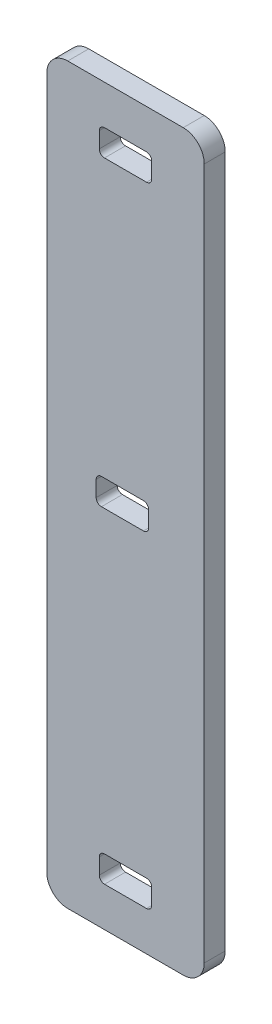
ISO-10303-21;
HEADER;
FILE_DESCRIPTION(('STEP AP214'),'2;1');
FILE_NAME('part.step','',(''),(''),'','','');
FILE_SCHEMA(('AUTOMOTIVE_DESIGN { 1 0 10303 214 1 1 1 1 }'));
ENDSEC;
DATA;
#1=APPLICATION_CONTEXT('core data for automotive mechanical design processes');
#2=APPLICATION_PROTOCOL_DEFINITION('international standard','automotive_design',2000,#1);
#3=PRODUCT_CONTEXT('',#1,'mechanical');
#4=PRODUCT('Part','Part','',(#3));
#5=PRODUCT_RELATED_PRODUCT_CATEGORY('part','',(#4));
#6=PRODUCT_DEFINITION_FORMATION('','',#4);
#7=PRODUCT_DEFINITION_CONTEXT('part definition',#1,'design');
#8=PRODUCT_DEFINITION('design','',#6,#7);
#9=PRODUCT_DEFINITION_SHAPE('','',#8);
#10=(LENGTH_UNIT() NAMED_UNIT(*) SI_UNIT(.MILLI.,.METRE.));
#11=(NAMED_UNIT(*) PLANE_ANGLE_UNIT() SI_UNIT($,.RADIAN.));
#12=(NAMED_UNIT(*) SI_UNIT($,.STERADIAN.) SOLID_ANGLE_UNIT());
#13=UNCERTAINTY_MEASURE_WITH_UNIT(LENGTH_MEASURE(1.E-05),#10,'distance_accuracy_value','');
#14=(GEOMETRIC_REPRESENTATION_CONTEXT(3) GLOBAL_UNCERTAINTY_ASSIGNED_CONTEXT((#13)) GLOBAL_UNIT_ASSIGNED_CONTEXT((#10,
#11,#12)) REPRESENTATION_CONTEXT('',''));
#15=CARTESIAN_POINT('',(0.,0.,0.));
#16=DIRECTION('',(0.,0.,1.));
#17=DIRECTION('',(1.,0.,0.));
#18=AXIS2_PLACEMENT_3D('',#15,#16,#17);
#19=CARTESIAN_POINT('',(-11.,-65.915,4.));
#20=DIRECTION('',(0.,0.,-1.));
#21=DIRECTION('',(-1.,0.,0.));
#22=AXIS2_PLACEMENT_3D('',#19,#20,#21);
#23=CYLINDRICAL_SURFACE('',#22,4.);
#24=CARTESIAN_POINT('',(-11.,-65.915,0.));
#25=DIRECTION('',(0.,0.,1.));
#26=DIRECTION('',(-1.,0.,0.));
#27=AXIS2_PLACEMENT_3D('',#24,#25,#26);
#28=CIRCLE('',#27,4.);
#29=CARTESIAN_POINT('',(-15.,-65.915,0.));
#30=VERTEX_POINT('',#29);
#31=CARTESIAN_POINT('',(-11.,-69.915,0.));
#32=VERTEX_POINT('',#31);
#33=EDGE_CURVE('E304',#30,#32,#28,.T.);
#34=ORIENTED_EDGE('',*,*,#33,.T.);
#35=DIRECTION('',(0.,0.,-1.));
#36=VECTOR('',#35,1.);
#37=CARTESIAN_POINT('',(-11.,-69.915,4.));
#38=LINE('',#37,#36);
#39=CARTESIAN_POINT('',(-11.,-69.915,4.));
#40=VERTEX_POINT('',#39);
#41=EDGE_CURVE('E11',#40,#32,#38,.T.);
#42=ORIENTED_EDGE('',*,*,#41,.F.);
#43=CARTESIAN_POINT('',(-11.,-65.915,4.));
#44=DIRECTION('',(0.,0.,1.));
#45=DIRECTION('',(-1.,0.,0.));
#46=AXIS2_PLACEMENT_3D('',#43,#44,#45);
#47=CIRCLE('',#46,4.);
#48=CARTESIAN_POINT('',(-15.,-65.915,4.));
#49=VERTEX_POINT('',#48);
#50=EDGE_CURVE('E441',#49,#40,#47,.T.);
#51=ORIENTED_EDGE('',*,*,#50,.F.);
#52=DIRECTION('',(0.,0.,-1.));
#53=VECTOR('',#52,1.);
#54=CARTESIAN_POINT('',(-15.,-65.915,4.));
#55=LINE('',#54,#53);
#56=EDGE_CURVE('E459',#49,#30,#55,.T.);
#57=ORIENTED_EDGE('',*,*,#56,.T.);
#58=EDGE_LOOP('',(#34,#42,#51,#57));
#59=FACE_BOUND('',#58,.T.);
#60=ADVANCED_FACE('F35',(#59),#23,.T.);
#61=CARTESIAN_POINT('',(-11.,-69.915,4.));
#62=DIRECTION('',(0.,1.,0.));
#63=DIRECTION('',(0.,0.,1.));
#64=AXIS2_PLACEMENT_3D('',#61,#62,#63);
#65=PLANE('',#64);
#66=DIRECTION('',(1.,0.,0.));
#67=VECTOR('',#66,1.);
#68=CARTESIAN_POINT('',(-11.,-69.915,0.));
#69=LINE('',#68,#67);
#70=CARTESIAN_POINT('',(11.,-69.915,0.));
#71=VERTEX_POINT('',#70);
#72=EDGE_CURVE('E462',#32,#71,#69,.T.);
#73=ORIENTED_EDGE('',*,*,#72,.T.);
#74=DIRECTION('',(0.,0.,-1.));
#75=VECTOR('',#74,1.);
#76=CARTESIAN_POINT('',(11.,-69.915,4.));
#77=LINE('',#76,#75);
#78=CARTESIAN_POINT('',(11.,-69.915,4.));
#79=VERTEX_POINT('',#78);
#80=EDGE_CURVE('E42',#79,#71,#77,.T.);
#81=ORIENTED_EDGE('',*,*,#80,.F.);
#82=DIRECTION('',(1.,0.,0.));
#83=VECTOR('',#82,1.);
#84=CARTESIAN_POINT('',(-11.,-69.915,4.));
#85=LINE('',#84,#83);
#86=EDGE_CURVE('E444',#40,#79,#85,.T.);
#87=ORIENTED_EDGE('',*,*,#86,.F.);
#88=ORIENTED_EDGE('',*,*,#41,.T.);
#89=EDGE_LOOP('',(#73,#81,#87,#88));
#90=FACE_BOUND('',#89,.T.);
#91=ADVANCED_FACE('F518',(#90),#65,.F.);
#92=CARTESIAN_POINT('',(11.,-65.915,4.));
#93=DIRECTION('',(0.,0.,-1.));
#94=DIRECTION('',(-1.,0.,0.));
#95=AXIS2_PLACEMENT_3D('',#92,#93,#94);
#96=CYLINDRICAL_SURFACE('',#95,4.);
#97=CARTESIAN_POINT('',(11.,-65.915,0.));
#98=DIRECTION('',(0.,0.,1.));
#99=DIRECTION('',(1.,0.,0.));
#100=AXIS2_PLACEMENT_3D('',#97,#98,#99);
#101=CIRCLE('',#100,4.);
#102=CARTESIAN_POINT('',(15.,-65.915,0.));
#103=VERTEX_POINT('',#102);
#104=EDGE_CURVE('E464',#71,#103,#101,.T.);
#105=ORIENTED_EDGE('',*,*,#104,.T.);
#106=DIRECTION('',(0.,0.,-1.));
#107=VECTOR('',#106,1.);
#108=CARTESIAN_POINT('',(15.,-65.915,4.));
#109=LINE('',#108,#107);
#110=CARTESIAN_POINT('',(15.,-65.915,4.));
#111=VERTEX_POINT('',#110);
#112=EDGE_CURVE('E489',#111,#103,#109,.T.);
#113=ORIENTED_EDGE('',*,*,#112,.F.);
#114=CARTESIAN_POINT('',(11.,-65.915,4.));
#115=DIRECTION('',(0.,0.,1.));
#116=DIRECTION('',(1.,0.,0.));
#117=AXIS2_PLACEMENT_3D('',#114,#115,#116);
#118=CIRCLE('',#117,4.);
#119=EDGE_CURVE('E447',#79,#111,#118,.T.);
#120=ORIENTED_EDGE('',*,*,#119,.F.);
#121=ORIENTED_EDGE('',*,*,#80,.T.);
#122=EDGE_LOOP('',(#105,#113,#120,#121));
#123=FACE_BOUND('',#122,.T.);
#124=ADVANCED_FACE('F496',(#123),#96,.T.);
#125=CARTESIAN_POINT('',(15.,-65.915,4.));
#126=DIRECTION('',(-1.,0.,0.));
#127=DIRECTION('',(0.,0.,1.));
#128=AXIS2_PLACEMENT_3D('',#125,#126,#127);
#129=PLANE('',#128);
#130=DIRECTION('',(0.,1.,0.));
#131=VECTOR('',#130,1.);
#132=CARTESIAN_POINT('',(15.,-65.915,0.));
#133=LINE('',#132,#131);
#134=CARTESIAN_POINT('',(15.,65.915,0.));
#135=VERTEX_POINT('',#134);
#136=EDGE_CURVE('E466',#103,#135,#133,.T.);
#137=ORIENTED_EDGE('',*,*,#136,.T.);
#138=DIRECTION('',(0.,0.,-1.));
#139=VECTOR('',#138,1.);
#140=CARTESIAN_POINT('',(15.,65.915,4.));
#141=LINE('',#140,#139);
#142=CARTESIAN_POINT('',(15.,65.915,4.));
#143=VERTEX_POINT('',#142);
#144=EDGE_CURVE('E486',#143,#135,#141,.T.);
#145=ORIENTED_EDGE('',*,*,#144,.F.);
#146=DIRECTION('',(0.,1.,0.));
#147=VECTOR('',#146,1.);
#148=CARTESIAN_POINT('',(15.,-65.915,4.));
#149=LINE('',#148,#147);
#150=EDGE_CURVE('E449',#111,#143,#149,.T.);
#151=ORIENTED_EDGE('',*,*,#150,.F.);
#152=ORIENTED_EDGE('',*,*,#112,.T.);
#153=EDGE_LOOP('',(#137,#145,#151,#152));
#154=FACE_BOUND('',#153,.T.);
#155=ADVANCED_FACE('F506',(#154),#129,.F.);
#156=CARTESIAN_POINT('',(11.,65.915,4.));
#157=DIRECTION('',(0.,0.,-1.));
#158=DIRECTION('',(-1.,0.,0.));
#159=AXIS2_PLACEMENT_3D('',#156,#157,#158);
#160=CYLINDRICAL_SURFACE('',#159,4.);
#161=CARTESIAN_POINT('',(11.,65.915,0.));
#162=DIRECTION('',(0.,0.,1.));
#163=DIRECTION('',(-1.,0.,0.));
#164=AXIS2_PLACEMENT_3D('',#161,#162,#163);
#165=CIRCLE('',#164,4.);
#166=CARTESIAN_POINT('',(11.,69.915,0.));
#167=VERTEX_POINT('',#166);
#168=EDGE_CURVE('E468',#135,#167,#165,.T.);
#169=ORIENTED_EDGE('',*,*,#168,.T.);
#170=DIRECTION('',(0.,0.,-1.));
#171=VECTOR('',#170,1.);
#172=CARTESIAN_POINT('',(11.,69.915,4.));
#173=LINE('',#172,#171);
#174=CARTESIAN_POINT('',(11.,69.915,4.));
#175=VERTEX_POINT('',#174);
#176=EDGE_CURVE('E483',#175,#167,#173,.T.);
#177=ORIENTED_EDGE('',*,*,#176,.F.);
#178=CARTESIAN_POINT('',(11.,65.915,4.));
#179=DIRECTION('',(0.,0.,1.));
#180=DIRECTION('',(-1.,0.,0.));
#181=AXIS2_PLACEMENT_3D('',#178,#179,#180);
#182=CIRCLE('',#181,4.);
#183=EDGE_CURVE('E451',#143,#175,#182,.T.);
#184=ORIENTED_EDGE('',*,*,#183,.F.);
#185=ORIENTED_EDGE('',*,*,#144,.T.);
#186=EDGE_LOOP('',(#169,#177,#184,#185));
#187=FACE_BOUND('',#186,.T.);
#188=ADVANCED_FACE('F510',(#187),#160,.T.);
#189=CARTESIAN_POINT('',(-11.,69.915,4.));
#190=DIRECTION('',(0.,-1.,0.));
#191=DIRECTION('',(0.,0.,-1.));
#192=AXIS2_PLACEMENT_3D('',#189,#190,#191);
#193=PLANE('',#192);
#194=DIRECTION('',(-1.,0.,0.));
#195=VECTOR('',#194,1.);
#196=CARTESIAN_POINT('',(-11.,69.915,0.));
#197=LINE('',#196,#195);
#198=CARTESIAN_POINT('',(-11.,69.915,0.));
#199=VERTEX_POINT('',#198);
#200=EDGE_CURVE('E470',#167,#199,#197,.T.);
#201=ORIENTED_EDGE('',*,*,#200,.T.);
#202=DIRECTION('',(0.,0.,-1.));
#203=VECTOR('',#202,1.);
#204=CARTESIAN_POINT('',(-11.,69.915,4.));
#205=LINE('',#204,#203);
#206=CARTESIAN_POINT('',(-11.,69.915,4.));
#207=VERTEX_POINT('',#206);
#208=EDGE_CURVE('E480',#207,#199,#205,.T.);
#209=ORIENTED_EDGE('',*,*,#208,.F.);
#210=DIRECTION('',(-1.,0.,0.));
#211=VECTOR('',#210,1.);
#212=CARTESIAN_POINT('',(-11.,69.915,4.));
#213=LINE('',#212,#211);
#214=EDGE_CURVE('E453',#175,#207,#213,.T.);
#215=ORIENTED_EDGE('',*,*,#214,.F.);
#216=ORIENTED_EDGE('',*,*,#176,.T.);
#217=EDGE_LOOP('',(#201,#209,#215,#216));
#218=FACE_BOUND('',#217,.T.);
#219=ADVANCED_FACE('F531',(#218),#193,.F.);
#220=CARTESIAN_POINT('',(-11.,65.915,4.));
#221=DIRECTION('',(0.,0.,-1.));
#222=DIRECTION('',(-1.,0.,0.));
#223=AXIS2_PLACEMENT_3D('',#220,#221,#222);
#224=CYLINDRICAL_SURFACE('',#223,4.);
#225=CARTESIAN_POINT('',(-11.,65.915,0.));
#226=DIRECTION('',(0.,0.,1.));
#227=DIRECTION('',(-1.,0.,0.));
#228=AXIS2_PLACEMENT_3D('',#225,#226,#227);
#229=CIRCLE('',#228,4.);
#230=CARTESIAN_POINT('',(-15.,65.915,0.));
#231=VERTEX_POINT('',#230);
#232=EDGE_CURVE('E472',#199,#231,#229,.T.);
#233=ORIENTED_EDGE('',*,*,#232,.T.);
#234=DIRECTION('',(0.,0.,-1.));
#235=VECTOR('',#234,1.);
#236=CARTESIAN_POINT('',(-15.,65.915,4.));
#237=LINE('',#236,#235);
#238=CARTESIAN_POINT('',(-15.,65.915,4.));
#239=VERTEX_POINT('',#238);
#240=EDGE_CURVE('E477',#239,#231,#237,.T.);
#241=ORIENTED_EDGE('',*,*,#240,.F.);
#242=CARTESIAN_POINT('',(-11.,65.915,4.));
#243=DIRECTION('',(0.,0.,1.));
#244=DIRECTION('',(-1.,0.,0.));
#245=AXIS2_PLACEMENT_3D('',#242,#243,#244);
#246=CIRCLE('',#245,4.);
#247=EDGE_CURVE('E455',#207,#239,#246,.T.);
#248=ORIENTED_EDGE('',*,*,#247,.F.);
#249=ORIENTED_EDGE('',*,*,#208,.T.);
#250=EDGE_LOOP('',(#233,#241,#248,#249));
#251=FACE_BOUND('',#250,.T.);
#252=ADVANCED_FACE('F529',(#251),#224,.T.);
#253=CARTESIAN_POINT('',(-15.,-65.915,4.));
#254=DIRECTION('',(1.,0.,0.));
#255=DIRECTION('',(0.,0.,-1.));
#256=AXIS2_PLACEMENT_3D('',#253,#254,#255);
#257=PLANE('',#256);
#258=DIRECTION('',(0.,-1.,0.));
#259=VECTOR('',#258,1.);
#260=CARTESIAN_POINT('',(-15.,-65.915,0.));
#261=LINE('',#260,#259);
#262=EDGE_CURVE('E445',#231,#30,#261,.T.);
#263=ORIENTED_EDGE('',*,*,#262,.T.);
#264=ORIENTED_EDGE('',*,*,#56,.F.);
#265=DIRECTION('',(0.,-1.,0.));
#266=VECTOR('',#265,1.);
#267=CARTESIAN_POINT('',(-15.,-65.915,4.));
#268=LINE('',#267,#266);
#269=EDGE_CURVE('E457',#239,#49,#268,.T.);
#270=ORIENTED_EDGE('',*,*,#269,.F.);
#271=ORIENTED_EDGE('',*,*,#240,.T.);
#272=EDGE_LOOP('',(#263,#264,#270,#271));
#273=FACE_BOUND('',#272,.T.);
#274=ADVANCED_FACE('F524',(#273),#257,.F.);
#275=CARTESIAN_POINT('',(-11.,-65.915,4.));
#276=DIRECTION('',(0.,0.,-1.));
#277=DIRECTION('',(-1.,0.,0.));
#278=AXIS2_PLACEMENT_3D('',#275,#276,#277);
#279=PLANE('',#278);
#280=DIRECTION('',(0.,-1.,0.));
#281=VECTOR('',#280,1.);
#282=CARTESIAN_POINT('',(-5.,61.415,4.));
#283=LINE('',#282,#281);
#284=CARTESIAN_POINT('',(-5.,61.415,4.));
#285=VERTEX_POINT('',#284);
#286=CARTESIAN_POINT('',(-5.,58.415,4.));
#287=VERTEX_POINT('',#286);
#288=EDGE_CURVE('E285',#285,#287,#283,.T.);
#289=ORIENTED_EDGE('',*,*,#288,.F.);
#290=CARTESIAN_POINT('',(-4.,61.415,4.));
#291=DIRECTION('',(0.,0.,1.));
#292=DIRECTION('',(1.,0.,0.));
#293=AXIS2_PLACEMENT_3D('',#290,#291,#292);
#294=CIRCLE('',#293,1.);
#295=CARTESIAN_POINT('',(-3.99999999999999,62.415,4.));
#296=VERTEX_POINT('',#295);
#297=EDGE_CURVE('E49',#296,#285,#294,.T.);
#298=ORIENTED_EDGE('',*,*,#297,.F.);
#299=DIRECTION('',(-1.,0.,0.));
#300=VECTOR('',#299,1.);
#301=CARTESIAN_POINT('',(-3.99999999999999,62.415,4.));
#302=LINE('',#301,#300);
#303=CARTESIAN_POINT('',(4.,62.415,4.));
#304=VERTEX_POINT('',#303);
#305=EDGE_CURVE('E265',#304,#296,#302,.T.);
#306=ORIENTED_EDGE('',*,*,#305,.F.);
#307=CARTESIAN_POINT('',(4.,61.415,4.));
#308=DIRECTION('',(0.,0.,1.));
#309=DIRECTION('',(-1.,0.,0.));
#310=AXIS2_PLACEMENT_3D('',#307,#308,#309);
#311=CIRCLE('',#310,1.);
#312=CARTESIAN_POINT('',(5.,61.415,4.));
#313=VERTEX_POINT('',#312);
#314=EDGE_CURVE('E268',#313,#304,#311,.T.);
#315=ORIENTED_EDGE('',*,*,#314,.F.);
#316=DIRECTION('',(0.,1.,0.));
#317=VECTOR('',#316,1.);
#318=CARTESIAN_POINT('',(5.,61.415,4.));
#319=LINE('',#318,#317);
#320=CARTESIAN_POINT('',(5.,58.415,4.));
#321=VERTEX_POINT('',#320);
#322=EDGE_CURVE('E297',#321,#313,#319,.T.);
#323=ORIENTED_EDGE('',*,*,#322,.F.);
#324=CARTESIAN_POINT('',(4.,58.415,4.));
#325=DIRECTION('',(0.,0.,1.));
#326=DIRECTION('',(1.,0.,0.));
#327=AXIS2_PLACEMENT_3D('',#324,#325,#326);
#328=CIRCLE('',#327,1.);
#329=CARTESIAN_POINT('',(4.,57.415,4.));
#330=VERTEX_POINT('',#329);
#331=EDGE_CURVE('E294',#330,#321,#328,.T.);
#332=ORIENTED_EDGE('',*,*,#331,.F.);
#333=DIRECTION('',(1.,0.,0.));
#334=VECTOR('',#333,1.);
#335=CARTESIAN_POINT('',(-3.99999999999999,57.415,4.));
#336=LINE('',#335,#334);
#337=CARTESIAN_POINT('',(-3.99999999999999,57.415,4.));
#338=VERTEX_POINT('',#337);
#339=EDGE_CURVE('E291',#338,#330,#336,.T.);
#340=ORIENTED_EDGE('',*,*,#339,.F.);
#341=CARTESIAN_POINT('',(-4.,58.415,4.));
#342=DIRECTION('',(0.,0.,1.));
#343=DIRECTION('',(1.,0.,0.));
#344=AXIS2_PLACEMENT_3D('',#341,#342,#343);
#345=CIRCLE('',#344,1.);
#346=EDGE_CURVE('E288',#287,#338,#345,.T.);
#347=ORIENTED_EDGE('',*,*,#346,.F.);
#348=EDGE_LOOP('',(#289,#298,#306,#315,#323,#332,#340,#347));
#349=FACE_BOUND('',#348,.T.);
#350=DIRECTION('',(0.,-1.,0.));
#351=VECTOR('',#350,1.);
#352=CARTESIAN_POINT('',(-5.,-58.415,4.));
#353=LINE('',#352,#351);
#354=CARTESIAN_POINT('',(-5.,-58.415,4.));
#355=VERTEX_POINT('',#354);
#356=CARTESIAN_POINT('',(-5.,-61.415,4.));
#357=VERTEX_POINT('',#356);
#358=EDGE_CURVE('E343',#355,#357,#353,.T.);
#359=ORIENTED_EDGE('',*,*,#358,.F.);
#360=CARTESIAN_POINT('',(-4.,-58.415,4.));
#361=DIRECTION('',(0.,0.,1.));
#362=DIRECTION('',(1.,0.,0.));
#363=AXIS2_PLACEMENT_3D('',#360,#361,#362);
#364=CIRCLE('',#363,1.);
#365=CARTESIAN_POINT('',(-3.99999999999999,-57.415,4.));
#366=VERTEX_POINT('',#365);
#367=EDGE_CURVE('E57',#366,#355,#364,.T.);
#368=ORIENTED_EDGE('',*,*,#367,.F.);
#369=DIRECTION('',(-1.,0.,0.));
#370=VECTOR('',#369,1.);
#371=CARTESIAN_POINT('',(-3.99999999999999,-57.415,4.));
#372=LINE('',#371,#370);
#373=CARTESIAN_POINT('',(4.,-57.415,4.));
#374=VERTEX_POINT('',#373);
#375=EDGE_CURVE('E320',#374,#366,#372,.T.);
#376=ORIENTED_EDGE('',*,*,#375,.F.);
#377=CARTESIAN_POINT('',(4.,-58.415,4.));
#378=DIRECTION('',(0.,0.,1.));
#379=DIRECTION('',(-1.,0.,0.));
#380=AXIS2_PLACEMENT_3D('',#377,#378,#379);
#381=CIRCLE('',#380,1.);
#382=CARTESIAN_POINT('',(5.,-58.415,4.));
#383=VERTEX_POINT('',#382);
#384=EDGE_CURVE('E359',#383,#374,#381,.T.);
#385=ORIENTED_EDGE('',*,*,#384,.F.);
#386=DIRECTION('',(0.,1.,0.));
#387=VECTOR('',#386,1.);
#388=CARTESIAN_POINT('',(5.,-58.415,4.));
#389=LINE('',#388,#387);
#390=CARTESIAN_POINT('',(5.,-61.415,4.));
#391=VERTEX_POINT('',#390);
#392=EDGE_CURVE('E356',#391,#383,#389,.T.);
#393=ORIENTED_EDGE('',*,*,#392,.F.);
#394=CARTESIAN_POINT('',(4.,-61.415,4.));
#395=DIRECTION('',(0.,0.,1.));
#396=DIRECTION('',(1.,0.,0.));
#397=AXIS2_PLACEMENT_3D('',#394,#395,#396);
#398=CIRCLE('',#397,1.);
#399=CARTESIAN_POINT('',(4.,-62.415,4.));
#400=VERTEX_POINT('',#399);
#401=EDGE_CURVE('E353',#400,#391,#398,.T.);
#402=ORIENTED_EDGE('',*,*,#401,.F.);
#403=DIRECTION('',(1.,0.,0.));
#404=VECTOR('',#403,1.);
#405=CARTESIAN_POINT('',(-3.99999999999999,-62.415,4.));
#406=LINE('',#405,#404);
#407=CARTESIAN_POINT('',(-3.99999999999999,-62.415,4.));
#408=VERTEX_POINT('',#407);
#409=EDGE_CURVE('E350',#408,#400,#406,.T.);
#410=ORIENTED_EDGE('',*,*,#409,.F.);
#411=CARTESIAN_POINT('',(-4.,-61.415,4.));
#412=DIRECTION('',(0.,0.,1.));
#413=DIRECTION('',(1.,0.,0.));
#414=AXIS2_PLACEMENT_3D('',#411,#412,#413);
#415=CIRCLE('',#414,1.);
#416=EDGE_CURVE('E347',#357,#408,#415,.T.);
#417=ORIENTED_EDGE('',*,*,#416,.F.);
#418=EDGE_LOOP('',(#359,#368,#376,#385,#393,#402,#410,#417));
#419=FACE_BOUND('',#418,.T.);
#420=DIRECTION('',(0.,-1.,0.));
#421=VECTOR('',#420,1.);
#422=CARTESIAN_POINT('',(-5.58762243909685,3.585,4.));
#423=LINE('',#422,#421);
#424=CARTESIAN_POINT('',(-5.58762243909685,3.58499999999999,4.));
#425=VERTEX_POINT('',#424);
#426=CARTESIAN_POINT('',(-5.58762243909685,0.585000000000002,4.));
#427=VERTEX_POINT('',#426);
#428=EDGE_CURVE('E406',#425,#427,#423,.T.);
#429=ORIENTED_EDGE('',*,*,#428,.F.);
#430=CARTESIAN_POINT('',(-4.58762243909685,3.585,4.));
#431=DIRECTION('',(0.,0.,1.));
#432=DIRECTION('',(1.,0.,0.));
#433=AXIS2_PLACEMENT_3D('',#430,#431,#432);
#434=CIRCLE('',#433,1.);
#435=CARTESIAN_POINT('',(-4.58762243909685,4.585,4.));
#436=VERTEX_POINT('',#435);
#437=EDGE_CURVE('E404',#436,#425,#434,.T.);
#438=ORIENTED_EDGE('',*,*,#437,.F.);
#439=DIRECTION('',(-1.,0.,0.));
#440=VECTOR('',#439,1.);
#441=CARTESIAN_POINT('',(-4.58762243909685,4.585,4.));
#442=LINE('',#441,#440);
#443=CARTESIAN_POINT('',(3.41237756090315,4.585,4.));
#444=VERTEX_POINT('',#443);
#445=EDGE_CURVE('E382',#444,#436,#442,.T.);
#446=ORIENTED_EDGE('',*,*,#445,.F.);
#447=CARTESIAN_POINT('',(3.41237756090315,3.585,4.));
#448=DIRECTION('',(0.,0.,1.));
#449=DIRECTION('',(-1.,0.,0.));
#450=AXIS2_PLACEMENT_3D('',#447,#448,#449);
#451=CIRCLE('',#450,1.);
#452=CARTESIAN_POINT('',(4.41237756090315,3.585,4.));
#453=VERTEX_POINT('',#452);
#454=EDGE_CURVE('E421',#453,#444,#451,.T.);
#455=ORIENTED_EDGE('',*,*,#454,.F.);
#456=DIRECTION('',(0.,1.,0.));
#457=VECTOR('',#456,1.);
#458=CARTESIAN_POINT('',(4.41237756090315,3.585,4.));
#459=LINE('',#458,#457);
#460=CARTESIAN_POINT('',(4.41237756090315,0.585000000000002,4.));
#461=VERTEX_POINT('',#460);
#462=EDGE_CURVE('E418',#461,#453,#459,.T.);
#463=ORIENTED_EDGE('',*,*,#462,.F.);
#464=CARTESIAN_POINT('',(3.41237756090315,0.585000000000002,4.));
#465=DIRECTION('',(0.,0.,1.));
#466=DIRECTION('',(1.,0.,0.));
#467=AXIS2_PLACEMENT_3D('',#464,#465,#466);
#468=CIRCLE('',#467,1.);
#469=CARTESIAN_POINT('',(3.41237756090315,-0.414999999999998,4.));
#470=VERTEX_POINT('',#469);
#471=EDGE_CURVE('E415',#470,#461,#468,.T.);
#472=ORIENTED_EDGE('',*,*,#471,.F.);
#473=DIRECTION('',(1.,0.,0.));
#474=VECTOR('',#473,1.);
#475=CARTESIAN_POINT('',(-4.58762243909685,-0.414999999999999,4.));
#476=LINE('',#475,#474);
#477=CARTESIAN_POINT('',(-4.58762243909685,-0.414999999999999,4.));
#478=VERTEX_POINT('',#477);
#479=EDGE_CURVE('E412',#478,#470,#476,.T.);
#480=ORIENTED_EDGE('',*,*,#479,.F.);
#481=CARTESIAN_POINT('',(-4.58762243909685,0.585000000000002,4.));
#482=DIRECTION('',(0.,0.,1.));
#483=DIRECTION('',(1.,0.,0.));
#484=AXIS2_PLACEMENT_3D('',#481,#482,#483);
#485=CIRCLE('',#484,1.);
#486=EDGE_CURVE('E409',#427,#478,#485,.T.);
#487=ORIENTED_EDGE('',*,*,#486,.F.);
#488=EDGE_LOOP('',(#429,#438,#446,#455,#463,#472,#480,#487));
#489=FACE_BOUND('',#488,.T.);
#490=ORIENTED_EDGE('',*,*,#50,.T.);
#491=ORIENTED_EDGE('',*,*,#86,.T.);
#492=ORIENTED_EDGE('',*,*,#119,.T.);
#493=ORIENTED_EDGE('',*,*,#150,.T.);
#494=ORIENTED_EDGE('',*,*,#183,.T.);
#495=ORIENTED_EDGE('',*,*,#214,.T.);
#496=ORIENTED_EDGE('',*,*,#247,.T.);
#497=ORIENTED_EDGE('',*,*,#269,.T.);
#498=EDGE_LOOP('',(#490,#491,#492,#493,#494,#495,#496,#497));
#499=FACE_BOUND('',#498,.T.);
#500=ADVANCED_FACE('F514',(#349,#419,#489,#499),#279,.F.);
#501=CARTESIAN_POINT('',(-11.,-65.915,0.));
#502=DIRECTION('',(0.,0.,-1.));
#503=DIRECTION('',(-1.,0.,0.));
#504=AXIS2_PLACEMENT_3D('',#501,#502,#503);
#505=PLANE('',#504);
#506=CARTESIAN_POINT('',(-4.,61.415,0.));
#507=DIRECTION('',(0.,0.,1.));
#508=DIRECTION('',(1.,0.,0.));
#509=AXIS2_PLACEMENT_3D('',#506,#507,#508);
#510=CIRCLE('',#509,1.);
#511=CARTESIAN_POINT('',(-3.99999999999999,62.415,0.));
#512=VERTEX_POINT('',#511);
#513=CARTESIAN_POINT('',(-5.,61.415,0.));
#514=VERTEX_POINT('',#513);
#515=EDGE_CURVE('E245',#512,#514,#510,.T.);
#516=ORIENTED_EDGE('',*,*,#515,.T.);
#517=DIRECTION('',(0.,-1.,0.));
#518=VECTOR('',#517,1.);
#519=CARTESIAN_POINT('',(-5.,61.415,0.));
#520=LINE('',#519,#518);
#521=CARTESIAN_POINT('',(-5.,58.415,0.));
#522=VERTEX_POINT('',#521);
#523=EDGE_CURVE('E255',#514,#522,#520,.T.);
#524=ORIENTED_EDGE('',*,*,#523,.T.);
#525=CARTESIAN_POINT('',(-4.,58.415,0.));
#526=DIRECTION('',(0.,0.,1.));
#527=DIRECTION('',(1.,0.,0.));
#528=AXIS2_PLACEMENT_3D('',#525,#526,#527);
#529=CIRCLE('',#528,1.);
#530=CARTESIAN_POINT('',(-3.99999999999999,57.415,0.));
#531=VERTEX_POINT('',#530);
#532=EDGE_CURVE('E259',#522,#531,#529,.T.);
#533=ORIENTED_EDGE('',*,*,#532,.T.);
#534=DIRECTION('',(1.,0.,0.));
#535=VECTOR('',#534,1.);
#536=CARTESIAN_POINT('',(-3.99999999999999,57.415,0.));
#537=LINE('',#536,#535);
#538=CARTESIAN_POINT('',(4.,57.415,0.));
#539=VERTEX_POINT('',#538);
#540=EDGE_CURVE('E272',#531,#539,#537,.T.);
#541=ORIENTED_EDGE('',*,*,#540,.T.);
#542=CARTESIAN_POINT('',(4.,58.415,0.));
#543=DIRECTION('',(0.,0.,1.));
#544=DIRECTION('',(1.,0.,0.));
#545=AXIS2_PLACEMENT_3D('',#542,#543,#544);
#546=CIRCLE('',#545,1.);
#547=CARTESIAN_POINT('',(5.,58.415,0.));
#548=VERTEX_POINT('',#547);
#549=EDGE_CURVE('E275',#539,#548,#546,.T.);
#550=ORIENTED_EDGE('',*,*,#549,.T.);
#551=DIRECTION('',(0.,1.,0.));
#552=VECTOR('',#551,1.);
#553=CARTESIAN_POINT('',(5.,61.415,0.));
#554=LINE('',#553,#552);
#555=CARTESIAN_POINT('',(5.,61.415,0.));
#556=VERTEX_POINT('',#555);
#557=EDGE_CURVE('E278',#548,#556,#554,.T.);
#558=ORIENTED_EDGE('',*,*,#557,.T.);
#559=CARTESIAN_POINT('',(4.,61.415,0.));
#560=DIRECTION('',(0.,0.,1.));
#561=DIRECTION('',(-1.,0.,0.));
#562=AXIS2_PLACEMENT_3D('',#559,#560,#561);
#563=CIRCLE('',#562,1.);
#564=CARTESIAN_POINT('',(4.,62.415,0.));
#565=VERTEX_POINT('',#564);
#566=EDGE_CURVE('E281',#556,#565,#563,.T.);
#567=ORIENTED_EDGE('',*,*,#566,.T.);
#568=DIRECTION('',(-1.,0.,0.));
#569=VECTOR('',#568,1.);
#570=CARTESIAN_POINT('',(-3.99999999999999,62.415,0.));
#571=LINE('',#570,#569);
#572=EDGE_CURVE('E251',#565,#512,#571,.T.);
#573=ORIENTED_EDGE('',*,*,#572,.T.);
#574=EDGE_LOOP('',(#516,#524,#533,#541,#550,#558,#567,#573));
#575=FACE_BOUND('',#574,.T.);
#576=CARTESIAN_POINT('',(-4.,-58.415,0.));
#577=DIRECTION('',(0.,0.,1.));
#578=DIRECTION('',(1.,0.,0.));
#579=AXIS2_PLACEMENT_3D('',#576,#577,#578);
#580=CIRCLE('',#579,1.);
#581=CARTESIAN_POINT('',(-3.99999999999999,-57.415,0.));
#582=VERTEX_POINT('',#581);
#583=CARTESIAN_POINT('',(-5.,-58.415,0.));
#584=VERTEX_POINT('',#583);
#585=EDGE_CURVE('E316',#582,#584,#580,.T.);
#586=ORIENTED_EDGE('',*,*,#585,.T.);
#587=DIRECTION('',(0.,-1.,0.));
#588=VECTOR('',#587,1.);
#589=CARTESIAN_POINT('',(-5.,-58.415,0.));
#590=LINE('',#589,#588);
#591=CARTESIAN_POINT('',(-5.,-61.415,0.));
#592=VERTEX_POINT('',#591);
#593=EDGE_CURVE('E319',#584,#592,#590,.T.);
#594=ORIENTED_EDGE('',*,*,#593,.T.);
#595=CARTESIAN_POINT('',(-4.,-61.415,0.));
#596=DIRECTION('',(0.,0.,1.));
#597=DIRECTION('',(1.,0.,0.));
#598=AXIS2_PLACEMENT_3D('',#595,#596,#597);
#599=CIRCLE('',#598,1.);
#600=CARTESIAN_POINT('',(-3.99999999999999,-62.415,0.));
#601=VERTEX_POINT('',#600);
#602=EDGE_CURVE('E323',#592,#601,#599,.T.);
#603=ORIENTED_EDGE('',*,*,#602,.T.);
#604=DIRECTION('',(1.,0.,0.));
#605=VECTOR('',#604,1.);
#606=CARTESIAN_POINT('',(-3.99999999999999,-62.415,0.));
#607=LINE('',#606,#605);
#608=CARTESIAN_POINT('',(4.,-62.415,0.));
#609=VERTEX_POINT('',#608);
#610=EDGE_CURVE('E326',#601,#609,#607,.T.);
#611=ORIENTED_EDGE('',*,*,#610,.T.);
#612=CARTESIAN_POINT('',(4.,-61.415,0.));
#613=DIRECTION('',(0.,0.,1.));
#614=DIRECTION('',(1.,0.,0.));
#615=AXIS2_PLACEMENT_3D('',#612,#613,#614);
#616=CIRCLE('',#615,1.);
#617=CARTESIAN_POINT('',(5.,-61.415,0.));
#618=VERTEX_POINT('',#617);
#619=EDGE_CURVE('E329',#609,#618,#616,.T.);
#620=ORIENTED_EDGE('',*,*,#619,.T.);
#621=DIRECTION('',(0.,1.,0.));
#622=VECTOR('',#621,1.);
#623=CARTESIAN_POINT('',(5.,-58.415,0.));
#624=LINE('',#623,#622);
#625=CARTESIAN_POINT('',(5.,-58.415,0.));
#626=VERTEX_POINT('',#625);
#627=EDGE_CURVE('E332',#618,#626,#624,.T.);
#628=ORIENTED_EDGE('',*,*,#627,.T.);
#629=CARTESIAN_POINT('',(4.,-58.415,0.));
#630=DIRECTION('',(0.,0.,1.));
#631=DIRECTION('',(-1.,0.,0.));
#632=AXIS2_PLACEMENT_3D('',#629,#630,#631);
#633=CIRCLE('',#632,1.);
#634=CARTESIAN_POINT('',(4.,-57.415,0.));
#635=VERTEX_POINT('',#634);
#636=EDGE_CURVE('E335',#626,#635,#633,.T.);
#637=ORIENTED_EDGE('',*,*,#636,.T.);
#638=DIRECTION('',(-1.,0.,0.));
#639=VECTOR('',#638,1.);
#640=CARTESIAN_POINT('',(-3.99999999999999,-57.415,0.));
#641=LINE('',#640,#639);
#642=EDGE_CURVE('E338',#635,#582,#641,.T.);
#643=ORIENTED_EDGE('',*,*,#642,.T.);
#644=EDGE_LOOP('',(#586,#594,#603,#611,#620,#628,#637,#643));
#645=FACE_BOUND('',#644,.T.);
#646=CARTESIAN_POINT('',(-4.58762243909685,3.585,0.));
#647=DIRECTION('',(0.,0.,1.));
#648=DIRECTION('',(1.,0.,0.));
#649=AXIS2_PLACEMENT_3D('',#646,#647,#648);
#650=CIRCLE('',#649,1.);
#651=CARTESIAN_POINT('',(-4.58762243909685,4.585,0.));
#652=VERTEX_POINT('',#651);
#653=CARTESIAN_POINT('',(-5.58762243909685,3.585,0.));
#654=VERTEX_POINT('',#653);
#655=EDGE_CURVE('E378',#652,#654,#650,.T.);
#656=ORIENTED_EDGE('',*,*,#655,.T.);
#657=DIRECTION('',(0.,-1.,0.));
#658=VECTOR('',#657,1.);
#659=CARTESIAN_POINT('',(-5.58762243909685,3.585,0.));
#660=LINE('',#659,#658);
#661=CARTESIAN_POINT('',(-5.58762243909685,0.585000000000002,0.));
#662=VERTEX_POINT('',#661);
#663=EDGE_CURVE('E381',#654,#662,#660,.T.);
#664=ORIENTED_EDGE('',*,*,#663,.T.);
#665=CARTESIAN_POINT('',(-4.58762243909685,0.585000000000002,0.));
#666=DIRECTION('',(0.,0.,1.));
#667=DIRECTION('',(1.,0.,0.));
#668=AXIS2_PLACEMENT_3D('',#665,#666,#667);
#669=CIRCLE('',#668,1.);
#670=CARTESIAN_POINT('',(-4.58762243909685,-0.414999999999999,0.));
#671=VERTEX_POINT('',#670);
#672=EDGE_CURVE('E385',#662,#671,#669,.T.);
#673=ORIENTED_EDGE('',*,*,#672,.T.);
#674=DIRECTION('',(1.,0.,0.));
#675=VECTOR('',#674,1.);
#676=CARTESIAN_POINT('',(-4.58762243909685,-0.414999999999999,0.));
#677=LINE('',#676,#675);
#678=CARTESIAN_POINT('',(3.41237756090315,-0.414999999999998,0.));
#679=VERTEX_POINT('',#678);
#680=EDGE_CURVE('E388',#671,#679,#677,.T.);
#681=ORIENTED_EDGE('',*,*,#680,.T.);
#682=CARTESIAN_POINT('',(3.41237756090315,0.585000000000002,0.));
#683=DIRECTION('',(0.,0.,1.));
#684=DIRECTION('',(1.,0.,0.));
#685=AXIS2_PLACEMENT_3D('',#682,#683,#684);
#686=CIRCLE('',#685,1.);
#687=CARTESIAN_POINT('',(4.41237756090315,0.585000000000002,0.));
#688=VERTEX_POINT('',#687);
#689=EDGE_CURVE('E391',#679,#688,#686,.T.);
#690=ORIENTED_EDGE('',*,*,#689,.T.);
#691=DIRECTION('',(0.,1.,0.));
#692=VECTOR('',#691,1.);
#693=CARTESIAN_POINT('',(4.41237756090315,3.585,0.));
#694=LINE('',#693,#692);
#695=CARTESIAN_POINT('',(4.41237756090315,3.585,0.));
#696=VERTEX_POINT('',#695);
#697=EDGE_CURVE('E394',#688,#696,#694,.T.);
#698=ORIENTED_EDGE('',*,*,#697,.T.);
#699=CARTESIAN_POINT('',(3.41237756090315,3.585,0.));
#700=DIRECTION('',(0.,0.,1.));
#701=DIRECTION('',(-1.,0.,0.));
#702=AXIS2_PLACEMENT_3D('',#699,#700,#701);
#703=CIRCLE('',#702,1.);
#704=CARTESIAN_POINT('',(3.41237756090315,4.585,0.));
#705=VERTEX_POINT('',#704);
#706=EDGE_CURVE('E397',#696,#705,#703,.T.);
#707=ORIENTED_EDGE('',*,*,#706,.T.);
#708=DIRECTION('',(-1.,0.,0.));
#709=VECTOR('',#708,1.);
#710=CARTESIAN_POINT('',(-4.58762243909685,4.585,0.));
#711=LINE('',#710,#709);
#712=EDGE_CURVE('E400',#705,#652,#711,.T.);
#713=ORIENTED_EDGE('',*,*,#712,.T.);
#714=EDGE_LOOP('',(#656,#664,#673,#681,#690,#698,#707,#713));
#715=FACE_BOUND('',#714,.T.);
#716=ORIENTED_EDGE('',*,*,#33,.F.);
#717=ORIENTED_EDGE('',*,*,#262,.F.);
#718=ORIENTED_EDGE('',*,*,#232,.F.);
#719=ORIENTED_EDGE('',*,*,#200,.F.);
#720=ORIENTED_EDGE('',*,*,#168,.F.);
#721=ORIENTED_EDGE('',*,*,#136,.F.);
#722=ORIENTED_EDGE('',*,*,#104,.F.);
#723=ORIENTED_EDGE('',*,*,#72,.F.);
#724=EDGE_LOOP('',(#716,#717,#718,#719,#720,#721,#722,#723));
#725=FACE_BOUND('',#724,.T.);
#726=ADVANCED_FACE('F261',(#575,#645,#715,#725),#505,.T.);
#727=CARTESIAN_POINT('',(-4.58762243909685,3.585,0.));
#728=DIRECTION('',(0.,0.,1.));
#729=DIRECTION('',(1.,0.,0.));
#730=AXIS2_PLACEMENT_3D('',#727,#728,#729);
#731=CYLINDRICAL_SURFACE('',#730,1.);
#732=ORIENTED_EDGE('',*,*,#437,.T.);
#733=DIRECTION('',(0.,0.,1.));
#734=VECTOR('',#733,1.);
#735=CARTESIAN_POINT('',(-5.58762243909685,3.585,0.));
#736=LINE('',#735,#734);
#737=EDGE_CURVE('E403',#654,#425,#736,.T.);
#738=ORIENTED_EDGE('',*,*,#737,.F.);
#739=ORIENTED_EDGE('',*,*,#655,.F.);
#740=DIRECTION('',(0.,0.,1.));
#741=VECTOR('',#740,1.);
#742=CARTESIAN_POINT('',(-4.58762243909685,4.585,0.));
#743=LINE('',#742,#741);
#744=EDGE_CURVE('E344',#652,#436,#743,.T.);
#745=ORIENTED_EDGE('',*,*,#744,.T.);
#746=EDGE_LOOP('',(#732,#738,#739,#745));
#747=FACE_BOUND('',#746,.T.);
#748=ADVANCED_FACE('F594',(#747),#731,.F.);
#749=CARTESIAN_POINT('',(-4.58762243909685,4.585,0.));
#750=DIRECTION('',(0.,1.,0.));
#751=DIRECTION('',(0.,0.,1.));
#752=AXIS2_PLACEMENT_3D('',#749,#750,#751);
#753=PLANE('',#752);
#754=ORIENTED_EDGE('',*,*,#445,.T.);
#755=ORIENTED_EDGE('',*,*,#744,.F.);
#756=ORIENTED_EDGE('',*,*,#712,.F.);
#757=DIRECTION('',(0.,0.,1.));
#758=VECTOR('',#757,1.);
#759=CARTESIAN_POINT('',(3.41237756090315,4.585,0.));
#760=LINE('',#759,#758);
#761=EDGE_CURVE('E427',#705,#444,#760,.T.);
#762=ORIENTED_EDGE('',*,*,#761,.T.);
#763=EDGE_LOOP('',(#754,#755,#756,#762));
#764=FACE_BOUND('',#763,.T.);
#765=ADVANCED_FACE('F603',(#764),#753,.F.);
#766=CARTESIAN_POINT('',(3.41237756090315,3.585,0.));
#767=DIRECTION('',(0.,0.,1.));
#768=DIRECTION('',(1.,0.,0.));
#769=AXIS2_PLACEMENT_3D('',#766,#767,#768);
#770=CYLINDRICAL_SURFACE('',#769,1.);
#771=ORIENTED_EDGE('',*,*,#454,.T.);
#772=ORIENTED_EDGE('',*,*,#761,.F.);
#773=ORIENTED_EDGE('',*,*,#706,.F.);
#774=DIRECTION('',(0.,0.,1.));
#775=VECTOR('',#774,1.);
#776=CARTESIAN_POINT('',(4.41237756090315,3.585,0.));
#777=LINE('',#776,#775);
#778=EDGE_CURVE('E429',#696,#453,#777,.T.);
#779=ORIENTED_EDGE('',*,*,#778,.T.);
#780=EDGE_LOOP('',(#771,#772,#773,#779));
#781=FACE_BOUND('',#780,.T.);
#782=ADVANCED_FACE('F613',(#781),#770,.F.);
#783=CARTESIAN_POINT('',(4.41237756090315,3.585,0.));
#784=DIRECTION('',(1.,0.,0.));
#785=DIRECTION('',(0.,1.,0.));
#786=AXIS2_PLACEMENT_3D('',#783,#784,#785);
#787=PLANE('',#786);
#788=ORIENTED_EDGE('',*,*,#462,.T.);
#789=ORIENTED_EDGE('',*,*,#778,.F.);
#790=ORIENTED_EDGE('',*,*,#697,.F.);
#791=DIRECTION('',(0.,0.,1.));
#792=VECTOR('',#791,1.);
#793=CARTESIAN_POINT('',(4.41237756090315,0.585000000000002,0.));
#794=LINE('',#793,#792);
#795=EDGE_CURVE('E431',#688,#461,#794,.T.);
#796=ORIENTED_EDGE('',*,*,#795,.T.);
#797=EDGE_LOOP('',(#788,#789,#790,#796));
#798=FACE_BOUND('',#797,.T.);
#799=ADVANCED_FACE('F623',(#798),#787,.F.);
#800=CARTESIAN_POINT('',(3.41237756090315,0.585000000000002,0.));
#801=DIRECTION('',(0.,0.,1.));
#802=DIRECTION('',(1.,0.,0.));
#803=AXIS2_PLACEMENT_3D('',#800,#801,#802);
#804=CYLINDRICAL_SURFACE('',#803,1.);
#805=ORIENTED_EDGE('',*,*,#471,.T.);
#806=ORIENTED_EDGE('',*,*,#795,.F.);
#807=ORIENTED_EDGE('',*,*,#689,.F.);
#808=DIRECTION('',(0.,0.,1.));
#809=VECTOR('',#808,1.);
#810=CARTESIAN_POINT('',(3.41237756090315,-0.414999999999998,0.));
#811=LINE('',#810,#809);
#812=EDGE_CURVE('E433',#679,#470,#811,.T.);
#813=ORIENTED_EDGE('',*,*,#812,.T.);
#814=EDGE_LOOP('',(#805,#806,#807,#813));
#815=FACE_BOUND('',#814,.T.);
#816=ADVANCED_FACE('F633',(#815),#804,.F.);
#817=CARTESIAN_POINT('',(-4.58762243909685,-0.414999999999999,0.));
#818=DIRECTION('',(0.,-1.,0.));
#819=DIRECTION('',(0.,0.,-1.));
#820=AXIS2_PLACEMENT_3D('',#817,#818,#819);
#821=PLANE('',#820);
#822=ORIENTED_EDGE('',*,*,#479,.T.);
#823=ORIENTED_EDGE('',*,*,#812,.F.);
#824=ORIENTED_EDGE('',*,*,#680,.F.);
#825=DIRECTION('',(0.,0.,1.));
#826=VECTOR('',#825,1.);
#827=CARTESIAN_POINT('',(-4.58762243909685,-0.414999999999999,0.));
#828=LINE('',#827,#826);
#829=EDGE_CURVE('E435',#671,#478,#828,.T.);
#830=ORIENTED_EDGE('',*,*,#829,.T.);
#831=EDGE_LOOP('',(#822,#823,#824,#830));
#832=FACE_BOUND('',#831,.T.);
#833=ADVANCED_FACE('F643',(#832),#821,.F.);
#834=CARTESIAN_POINT('',(-4.58762243909685,0.585000000000002,0.));
#835=DIRECTION('',(0.,0.,1.));
#836=DIRECTION('',(1.,0.,0.));
#837=AXIS2_PLACEMENT_3D('',#834,#835,#836);
#838=CYLINDRICAL_SURFACE('',#837,1.);
#839=ORIENTED_EDGE('',*,*,#486,.T.);
#840=ORIENTED_EDGE('',*,*,#829,.F.);
#841=ORIENTED_EDGE('',*,*,#672,.F.);
#842=DIRECTION('',(0.,0.,1.));
#843=VECTOR('',#842,1.);
#844=CARTESIAN_POINT('',(-5.58762243909685,0.585000000000002,0.));
#845=LINE('',#844,#843);
#846=EDGE_CURVE('E437',#662,#427,#845,.T.);
#847=ORIENTED_EDGE('',*,*,#846,.T.);
#848=EDGE_LOOP('',(#839,#840,#841,#847));
#849=FACE_BOUND('',#848,.T.);
#850=ADVANCED_FACE('F653',(#849),#838,.F.);
#851=CARTESIAN_POINT('',(-5.58762243909685,3.585,0.));
#852=DIRECTION('',(-1.,0.,0.));
#853=DIRECTION('',(0.,-1.,0.));
#854=AXIS2_PLACEMENT_3D('',#851,#852,#853);
#855=PLANE('',#854);
#856=ORIENTED_EDGE('',*,*,#428,.T.);
#857=ORIENTED_EDGE('',*,*,#846,.F.);
#858=ORIENTED_EDGE('',*,*,#663,.F.);
#859=ORIENTED_EDGE('',*,*,#737,.T.);
#860=EDGE_LOOP('',(#856,#857,#858,#859));
#861=FACE_BOUND('',#860,.T.);
#862=ADVANCED_FACE('F663',(#861),#855,.F.);
#863=CARTESIAN_POINT('',(-4.,-58.415,0.));
#864=DIRECTION('',(0.,0.,1.));
#865=DIRECTION('',(1.,0.,0.));
#866=AXIS2_PLACEMENT_3D('',#863,#864,#865);
#867=CYLINDRICAL_SURFACE('',#866,1.);
#868=ORIENTED_EDGE('',*,*,#367,.T.);
#869=DIRECTION('',(0.,0.,1.));
#870=VECTOR('',#869,1.);
#871=CARTESIAN_POINT('',(-5.,-58.415,0.));
#872=LINE('',#871,#870);
#873=EDGE_CURVE('E341',#584,#355,#872,.T.);
#874=ORIENTED_EDGE('',*,*,#873,.F.);
#875=ORIENTED_EDGE('',*,*,#585,.F.);
#876=DIRECTION('',(0.,0.,1.));
#877=VECTOR('',#876,1.);
#878=CARTESIAN_POINT('',(-3.99999999999999,-57.415,0.));
#879=LINE('',#878,#877);
#880=EDGE_CURVE('E286',#582,#366,#879,.T.);
#881=ORIENTED_EDGE('',*,*,#880,.T.);
#882=EDGE_LOOP('',(#868,#874,#875,#881));
#883=FACE_BOUND('',#882,.T.);
#884=ADVANCED_FACE('F673',(#883),#867,.F.);
#885=CARTESIAN_POINT('',(-3.99999999999999,-57.415,0.));
#886=DIRECTION('',(0.,1.,0.));
#887=DIRECTION('',(0.,0.,1.));
#888=AXIS2_PLACEMENT_3D('',#885,#886,#887);
#889=PLANE('',#888);
#890=ORIENTED_EDGE('',*,*,#375,.T.);
#891=ORIENTED_EDGE('',*,*,#880,.F.);
#892=ORIENTED_EDGE('',*,*,#642,.F.);
#893=DIRECTION('',(0.,0.,1.));
#894=VECTOR('',#893,1.);
#895=CARTESIAN_POINT('',(4.,-57.415,0.));
#896=LINE('',#895,#894);
#897=EDGE_CURVE('E365',#635,#374,#896,.T.);
#898=ORIENTED_EDGE('',*,*,#897,.T.);
#899=EDGE_LOOP('',(#890,#891,#892,#898));
#900=FACE_BOUND('',#899,.T.);
#901=ADVANCED_FACE('F683',(#900),#889,.F.);
#902=CARTESIAN_POINT('',(4.,-58.415,0.));
#903=DIRECTION('',(0.,0.,1.));
#904=DIRECTION('',(1.,0.,0.));
#905=AXIS2_PLACEMENT_3D('',#902,#903,#904);
#906=CYLINDRICAL_SURFACE('',#905,1.);
#907=ORIENTED_EDGE('',*,*,#384,.T.);
#908=ORIENTED_EDGE('',*,*,#897,.F.);
#909=ORIENTED_EDGE('',*,*,#636,.F.);
#910=DIRECTION('',(0.,0.,1.));
#911=VECTOR('',#910,1.);
#912=CARTESIAN_POINT('',(5.,-58.415,0.));
#913=LINE('',#912,#911);
#914=EDGE_CURVE('E367',#626,#383,#913,.T.);
#915=ORIENTED_EDGE('',*,*,#914,.T.);
#916=EDGE_LOOP('',(#907,#908,#909,#915));
#917=FACE_BOUND('',#916,.T.);
#918=ADVANCED_FACE('F692',(#917),#906,.F.);
#919=CARTESIAN_POINT('',(5.,-58.415,0.));
#920=DIRECTION('',(1.,0.,0.));
#921=DIRECTION('',(0.,1.,0.));
#922=AXIS2_PLACEMENT_3D('',#919,#920,#921);
#923=PLANE('',#922);
#924=ORIENTED_EDGE('',*,*,#392,.T.);
#925=ORIENTED_EDGE('',*,*,#914,.F.);
#926=ORIENTED_EDGE('',*,*,#627,.F.);
#927=DIRECTION('',(0.,0.,1.));
#928=VECTOR('',#927,1.);
#929=CARTESIAN_POINT('',(5.,-61.415,0.));
#930=LINE('',#929,#928);
#931=EDGE_CURVE('E369',#618,#391,#930,.T.);
#932=ORIENTED_EDGE('',*,*,#931,.T.);
#933=EDGE_LOOP('',(#924,#925,#926,#932));
#934=FACE_BOUND('',#933,.T.);
#935=ADVANCED_FACE('F702',(#934),#923,.F.);
#936=CARTESIAN_POINT('',(4.,-61.415,0.));
#937=DIRECTION('',(0.,0.,1.));
#938=DIRECTION('',(1.,0.,0.));
#939=AXIS2_PLACEMENT_3D('',#936,#937,#938);
#940=CYLINDRICAL_SURFACE('',#939,1.);
#941=ORIENTED_EDGE('',*,*,#401,.T.);
#942=ORIENTED_EDGE('',*,*,#931,.F.);
#943=ORIENTED_EDGE('',*,*,#619,.F.);
#944=DIRECTION('',(0.,0.,1.));
#945=VECTOR('',#944,1.);
#946=CARTESIAN_POINT('',(4.,-62.415,0.));
#947=LINE('',#946,#945);
#948=EDGE_CURVE('E371',#609,#400,#947,.T.);
#949=ORIENTED_EDGE('',*,*,#948,.T.);
#950=EDGE_LOOP('',(#941,#942,#943,#949));
#951=FACE_BOUND('',#950,.T.);
#952=ADVANCED_FACE('F712',(#951),#940,.F.);
#953=CARTESIAN_POINT('',(-3.99999999999999,-62.415,0.));
#954=DIRECTION('',(0.,-1.,0.));
#955=DIRECTION('',(0.,0.,-1.));
#956=AXIS2_PLACEMENT_3D('',#953,#954,#955);
#957=PLANE('',#956);
#958=ORIENTED_EDGE('',*,*,#409,.T.);
#959=ORIENTED_EDGE('',*,*,#948,.F.);
#960=ORIENTED_EDGE('',*,*,#610,.F.);
#961=DIRECTION('',(0.,0.,1.));
#962=VECTOR('',#961,1.);
#963=CARTESIAN_POINT('',(-3.99999999999999,-62.415,0.));
#964=LINE('',#963,#962);
#965=EDGE_CURVE('E373',#601,#408,#964,.T.);
#966=ORIENTED_EDGE('',*,*,#965,.T.);
#967=EDGE_LOOP('',(#958,#959,#960,#966));
#968=FACE_BOUND('',#967,.T.);
#969=ADVANCED_FACE('F722',(#968),#957,.F.);
#970=CARTESIAN_POINT('',(-4.,-61.415,0.));
#971=DIRECTION('',(0.,0.,1.));
#972=DIRECTION('',(1.,0.,0.));
#973=AXIS2_PLACEMENT_3D('',#970,#971,#972);
#974=CYLINDRICAL_SURFACE('',#973,1.);
#975=ORIENTED_EDGE('',*,*,#416,.T.);
#976=ORIENTED_EDGE('',*,*,#965,.F.);
#977=ORIENTED_EDGE('',*,*,#602,.F.);
#978=DIRECTION('',(0.,0.,1.));
#979=VECTOR('',#978,1.);
#980=CARTESIAN_POINT('',(-5.,-61.415,0.));
#981=LINE('',#980,#979);
#982=EDGE_CURVE('E375',#592,#357,#981,.T.);
#983=ORIENTED_EDGE('',*,*,#982,.T.);
#984=EDGE_LOOP('',(#975,#976,#977,#983));
#985=FACE_BOUND('',#984,.T.);
#986=ADVANCED_FACE('F732',(#985),#974,.F.);
#987=CARTESIAN_POINT('',(-5.,-58.415,0.));
#988=DIRECTION('',(-1.,0.,0.));
#989=DIRECTION('',(0.,0.,1.));
#990=AXIS2_PLACEMENT_3D('',#987,#988,#989);
#991=PLANE('',#990);
#992=ORIENTED_EDGE('',*,*,#358,.T.);
#993=ORIENTED_EDGE('',*,*,#982,.F.);
#994=ORIENTED_EDGE('',*,*,#593,.F.);
#995=ORIENTED_EDGE('',*,*,#873,.T.);
#996=EDGE_LOOP('',(#992,#993,#994,#995));
#997=FACE_BOUND('',#996,.T.);
#998=ADVANCED_FACE('F742',(#997),#991,.F.);
#999=CARTESIAN_POINT('',(-4.,61.415,0.));
#1000=DIRECTION('',(0.,0.,1.));
#1001=DIRECTION('',(1.,0.,0.));
#1002=AXIS2_PLACEMENT_3D('',#999,#1000,#1001);
#1003=CYLINDRICAL_SURFACE('',#1002,1.);
#1004=ORIENTED_EDGE('',*,*,#297,.T.);
#1005=DIRECTION('',(0.,0.,1.));
#1006=VECTOR('',#1005,1.);
#1007=CARTESIAN_POINT('',(-5.,61.415,0.));
#1008=LINE('',#1007,#1006);
#1009=EDGE_CURVE('E241',#514,#285,#1008,.T.);
#1010=ORIENTED_EDGE('',*,*,#1009,.F.);
#1011=ORIENTED_EDGE('',*,*,#515,.F.);
#1012=DIRECTION('',(0.,0.,1.));
#1013=VECTOR('',#1012,1.);
#1014=CARTESIAN_POINT('',(-3.99999999999999,62.415,0.));
#1015=LINE('',#1014,#1013);
#1016=EDGE_CURVE('E302',#512,#296,#1015,.T.);
#1017=ORIENTED_EDGE('',*,*,#1016,.T.);
#1018=EDGE_LOOP('',(#1004,#1010,#1011,#1017));
#1019=FACE_BOUND('',#1018,.T.);
#1020=ADVANCED_FACE('F243',(#1019),#1003,.F.);
#1021=CARTESIAN_POINT('',(-3.99999999999999,62.415,0.));
#1022=DIRECTION('',(0.,1.,0.));
#1023=DIRECTION('',(0.,0.,1.));
#1024=AXIS2_PLACEMENT_3D('',#1021,#1022,#1023);
#1025=PLANE('',#1024);
#1026=ORIENTED_EDGE('',*,*,#305,.T.);
#1027=ORIENTED_EDGE('',*,*,#1016,.F.);
#1028=ORIENTED_EDGE('',*,*,#572,.F.);
#1029=DIRECTION('',(0.,0.,1.));
#1030=VECTOR('',#1029,1.);
#1031=CARTESIAN_POINT('',(4.,62.415,0.));
#1032=LINE('',#1031,#1030);
#1033=EDGE_CURVE('E305',#565,#304,#1032,.T.);
#1034=ORIENTED_EDGE('',*,*,#1033,.T.);
#1035=EDGE_LOOP('',(#1026,#1027,#1028,#1034));
#1036=FACE_BOUND('',#1035,.T.);
#1037=ADVANCED_FACE('F761',(#1036),#1025,.F.);
#1038=CARTESIAN_POINT('',(4.,61.415,0.));
#1039=DIRECTION('',(0.,0.,1.));
#1040=DIRECTION('',(1.,0.,0.));
#1041=AXIS2_PLACEMENT_3D('',#1038,#1039,#1040);
#1042=CYLINDRICAL_SURFACE('',#1041,1.);
#1043=ORIENTED_EDGE('',*,*,#314,.T.);
#1044=ORIENTED_EDGE('',*,*,#1033,.F.);
#1045=ORIENTED_EDGE('',*,*,#566,.F.);
#1046=DIRECTION('',(0.,0.,1.));
#1047=VECTOR('',#1046,1.);
#1048=CARTESIAN_POINT('',(5.,61.415,0.));
#1049=LINE('',#1048,#1047);
#1050=EDGE_CURVE('E307',#556,#313,#1049,.T.);
#1051=ORIENTED_EDGE('',*,*,#1050,.T.);
#1052=EDGE_LOOP('',(#1043,#1044,#1045,#1051));
#1053=FACE_BOUND('',#1052,.T.);
#1054=ADVANCED_FACE('F770',(#1053),#1042,.F.);
#1055=CARTESIAN_POINT('',(5.,61.415,0.));
#1056=DIRECTION('',(1.,0.,0.));
#1057=DIRECTION('',(0.,1.,0.));
#1058=AXIS2_PLACEMENT_3D('',#1055,#1056,#1057);
#1059=PLANE('',#1058);
#1060=ORIENTED_EDGE('',*,*,#322,.T.);
#1061=ORIENTED_EDGE('',*,*,#1050,.F.);
#1062=ORIENTED_EDGE('',*,*,#557,.F.);
#1063=DIRECTION('',(0.,0.,1.));
#1064=VECTOR('',#1063,1.);
#1065=CARTESIAN_POINT('',(5.,58.415,0.));
#1066=LINE('',#1065,#1064);
#1067=EDGE_CURVE('E309',#548,#321,#1066,.T.);
#1068=ORIENTED_EDGE('',*,*,#1067,.T.);
#1069=EDGE_LOOP('',(#1060,#1061,#1062,#1068));
#1070=FACE_BOUND('',#1069,.T.);
#1071=ADVANCED_FACE('F780',(#1070),#1059,.F.);
#1072=CARTESIAN_POINT('',(4.,58.415,0.));
#1073=DIRECTION('',(0.,0.,1.));
#1074=DIRECTION('',(1.,0.,0.));
#1075=AXIS2_PLACEMENT_3D('',#1072,#1073,#1074);
#1076=CYLINDRICAL_SURFACE('',#1075,1.);
#1077=ORIENTED_EDGE('',*,*,#331,.T.);
#1078=ORIENTED_EDGE('',*,*,#1067,.F.);
#1079=ORIENTED_EDGE('',*,*,#549,.F.);
#1080=DIRECTION('',(0.,0.,1.));
#1081=VECTOR('',#1080,1.);
#1082=CARTESIAN_POINT('',(4.,57.415,0.));
#1083=LINE('',#1082,#1081);
#1084=EDGE_CURVE('E311',#539,#330,#1083,.T.);
#1085=ORIENTED_EDGE('',*,*,#1084,.T.);
#1086=EDGE_LOOP('',(#1077,#1078,#1079,#1085));
#1087=FACE_BOUND('',#1086,.T.);
#1088=ADVANCED_FACE('F790',(#1087),#1076,.F.);
#1089=CARTESIAN_POINT('',(-3.99999999999999,57.415,0.));
#1090=DIRECTION('',(0.,-1.,0.));
#1091=DIRECTION('',(0.,0.,-1.));
#1092=AXIS2_PLACEMENT_3D('',#1089,#1090,#1091);
#1093=PLANE('',#1092);
#1094=ORIENTED_EDGE('',*,*,#339,.T.);
#1095=ORIENTED_EDGE('',*,*,#1084,.F.);
#1096=ORIENTED_EDGE('',*,*,#540,.F.);
#1097=DIRECTION('',(0.,0.,1.));
#1098=VECTOR('',#1097,1.);
#1099=CARTESIAN_POINT('',(-3.99999999999999,57.415,0.));
#1100=LINE('',#1099,#1098);
#1101=EDGE_CURVE('E313',#531,#338,#1100,.T.);
#1102=ORIENTED_EDGE('',*,*,#1101,.T.);
#1103=EDGE_LOOP('',(#1094,#1095,#1096,#1102));
#1104=FACE_BOUND('',#1103,.T.);
#1105=ADVANCED_FACE('F800',(#1104),#1093,.F.);
#1106=CARTESIAN_POINT('',(-4.,58.415,0.));
#1107=DIRECTION('',(0.,0.,1.));
#1108=DIRECTION('',(1.,0.,0.));
#1109=AXIS2_PLACEMENT_3D('',#1106,#1107,#1108);
#1110=CYLINDRICAL_SURFACE('',#1109,1.);
#1111=ORIENTED_EDGE('',*,*,#346,.T.);
#1112=ORIENTED_EDGE('',*,*,#1101,.F.);
#1113=ORIENTED_EDGE('',*,*,#532,.F.);
#1114=DIRECTION('',(0.,0.,1.));
#1115=VECTOR('',#1114,1.);
#1116=CARTESIAN_POINT('',(-5.,58.415,0.));
#1117=LINE('',#1116,#1115);
#1118=EDGE_CURVE('E250',#522,#287,#1117,.T.);
#1119=ORIENTED_EDGE('',*,*,#1118,.T.);
#1120=EDGE_LOOP('',(#1111,#1112,#1113,#1119));
#1121=FACE_BOUND('',#1120,.T.);
#1122=ADVANCED_FACE('F810',(#1121),#1110,.F.);
#1123=CARTESIAN_POINT('',(-5.,61.415,0.));
#1124=DIRECTION('',(-1.,0.,0.));
#1125=DIRECTION('',(0.,-1.,0.));
#1126=AXIS2_PLACEMENT_3D('',#1123,#1124,#1125);
#1127=PLANE('',#1126);
#1128=ORIENTED_EDGE('',*,*,#288,.T.);
#1129=ORIENTED_EDGE('',*,*,#1118,.F.);
#1130=ORIENTED_EDGE('',*,*,#523,.F.);
#1131=ORIENTED_EDGE('',*,*,#1009,.T.);
#1132=EDGE_LOOP('',(#1128,#1129,#1130,#1131));
#1133=FACE_BOUND('',#1132,.T.);
#1134=ADVANCED_FACE('F256',(#1133),#1127,.F.);
#1135=CLOSED_SHELL('',(#60,#91,#124,#155,#188,#219,#252,#274,#500,#726,#748,#765,#782,#799,#816,
#833,#850,#862,#884,#901,#918,#935,#952,#969,#986,#998,#1020,#1037,#1054,#1071,#1088,#1105,
#1122,#1134));
#1136=MANIFOLD_SOLID_BREP('B2',#1135);
#1137=ADVANCED_BREP_SHAPE_REPRESENTATION('',(#18,#1136),#14);
#1138=SHAPE_DEFINITION_REPRESENTATION(#9,#1137);
ENDSEC;
END-ISO-10303-21;
